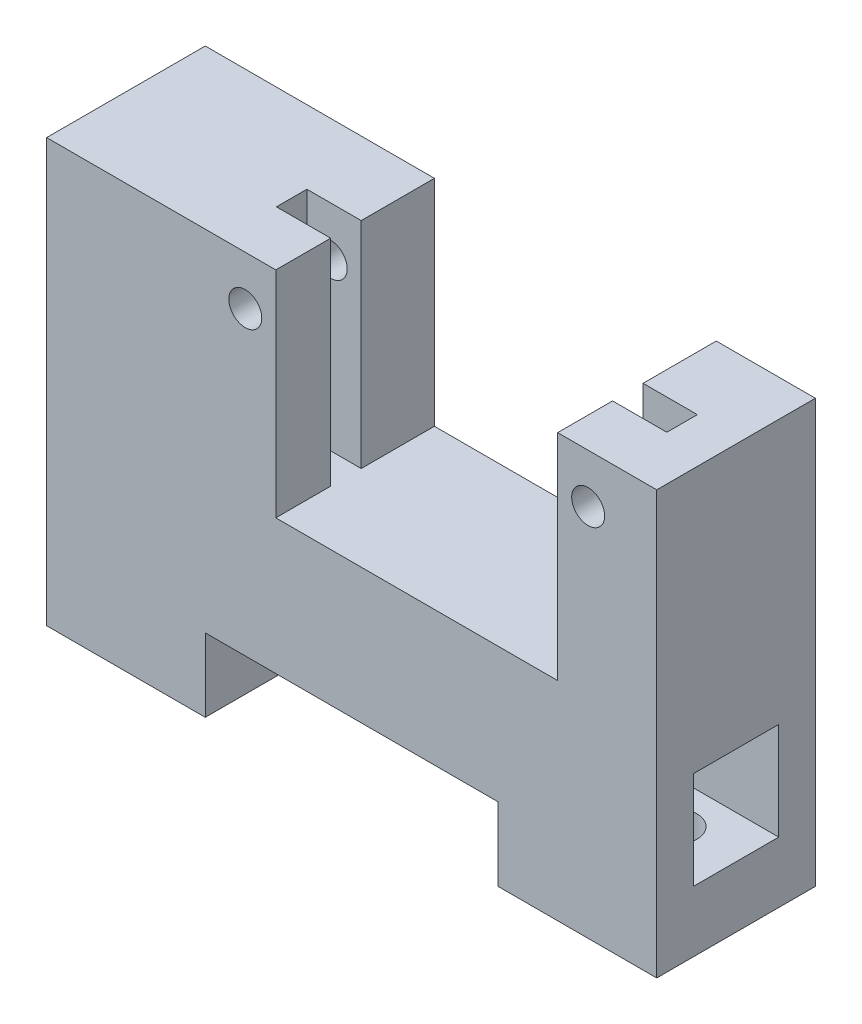
ISO-10303-21;
HEADER;
FILE_DESCRIPTION(('STEP AP214'),'2;1');
FILE_NAME('part.step','',(''),(''),'','','');
FILE_SCHEMA(('AUTOMOTIVE_DESIGN { 1 0 10303 214 1 1 1 1 }'));
ENDSEC;
DATA;
#1=APPLICATION_CONTEXT('core data for automotive mechanical design processes');
#2=APPLICATION_PROTOCOL_DEFINITION('international standard','automotive_design',2000,#1);
#3=PRODUCT_CONTEXT('',#1,'mechanical');
#4=PRODUCT('Part','Part','',(#3));
#5=PRODUCT_RELATED_PRODUCT_CATEGORY('part','',(#4));
#6=PRODUCT_DEFINITION_FORMATION('','',#4);
#7=PRODUCT_DEFINITION_CONTEXT('part definition',#1,'design');
#8=PRODUCT_DEFINITION('design','',#6,#7);
#9=PRODUCT_DEFINITION_SHAPE('','',#8);
#10=(LENGTH_UNIT() NAMED_UNIT(*) SI_UNIT(.MILLI.,.METRE.));
#11=(NAMED_UNIT(*) PLANE_ANGLE_UNIT() SI_UNIT($,.RADIAN.));
#12=(NAMED_UNIT(*) SI_UNIT($,.STERADIAN.) SOLID_ANGLE_UNIT());
#13=UNCERTAINTY_MEASURE_WITH_UNIT(LENGTH_MEASURE(1.E-05),#10,'distance_accuracy_value','');
#14=(GEOMETRIC_REPRESENTATION_CONTEXT(3) GLOBAL_UNCERTAINTY_ASSIGNED_CONTEXT((#13)) GLOBAL_UNIT_ASSIGNED_CONTEXT((#10,
#11,#12)) REPRESENTATION_CONTEXT('',''));
#15=CARTESIAN_POINT('',(0.,0.,0.));
#16=DIRECTION('',(0.,0.,1.));
#17=DIRECTION('',(1.,0.,0.));
#18=AXIS2_PLACEMENT_3D('',#15,#16,#17);
#19=CARTESIAN_POINT('',(0.,-2.65,0.));
#20=DIRECTION('',(0.,-1.,0.));
#21=DIRECTION('',(0.,0.,-1.));
#22=AXIS2_PLACEMENT_3D('',#19,#20,#21);
#23=PLANE('',#22);
#24=CARTESIAN_POINT('',(37.17,-2.65,0.499999999999999));
#25=DIRECTION('',(0.,-1.,0.));
#26=DIRECTION('',(0.,0.,-1.));
#27=AXIS2_PLACEMENT_3D('',#24,#25,#26);
#28=CIRCLE('',#27,1.8);
#29=CARTESIAN_POINT('',(37.17,-2.65,-1.3));
#30=VERTEX_POINT('',#29);
#31=EDGE_CURVE('E672',#30,#30,#28,.T.);
#32=ORIENTED_EDGE('',*,*,#31,.F.);
#33=EDGE_LOOP('',(#32));
#34=FACE_BOUND('',#33,.T.);
#35=DIRECTION('',(0.,0.,-1.));
#36=VECTOR('',#35,1.);
#37=CARTESIAN_POINT('',(29.17,-2.65,7.));
#38=LINE('',#37,#36);
#39=CARTESIAN_POINT('',(29.17,-2.65,7.));
#40=VERTEX_POINT('',#39);
#41=CARTESIAN_POINT('',(29.17,-2.65,-6.));
#42=VERTEX_POINT('',#41);
#43=EDGE_CURVE('E339',#40,#42,#38,.T.);
#44=ORIENTED_EDGE('',*,*,#43,.T.);
#45=DIRECTION('',(1.,0.,0.));
#46=VECTOR('',#45,1.);
#47=CARTESIAN_POINT('',(0.,-2.65,-6.));
#48=LINE('',#47,#46);
#49=CARTESIAN_POINT('',(42.17,-2.65,-6.));
#50=VERTEX_POINT('',#49);
#51=EDGE_CURVE('E389',#42,#50,#48,.T.);
#52=ORIENTED_EDGE('',*,*,#51,.T.);
#53=DIRECTION('',(0.,0.,-1.));
#54=VECTOR('',#53,1.);
#55=CARTESIAN_POINT('',(42.17,-2.65,7.));
#56=LINE('',#55,#54);
#57=CARTESIAN_POINT('',(42.17,-2.65,7.));
#58=VERTEX_POINT('',#57);
#59=EDGE_CURVE('E382',#58,#50,#56,.T.);
#60=ORIENTED_EDGE('',*,*,#59,.F.);
#61=DIRECTION('',(-1.,0.,0.));
#62=VECTOR('',#61,1.);
#63=CARTESIAN_POINT('',(45.,-2.65,7.));
#64=LINE('',#63,#62);
#65=EDGE_CURVE('E393',#58,#40,#64,.T.);
#66=ORIENTED_EDGE('',*,*,#65,.T.);
#67=EDGE_LOOP('',(#44,#52,#60,#66));
#68=FACE_BOUND('',#67,.T.);
#69=ADVANCED_FACE('F42',(#34,#68),#23,.T.);
#70=CARTESIAN_POINT('',(34.05,32.,-6.));
#71=DIRECTION('',(1.,0.,0.));
#72=DIRECTION('',(0.,0.,-1.));
#73=AXIS2_PLACEMENT_3D('',#70,#71,#72);
#74=PLANE('',#73);
#75=DIRECTION('',(0.,0.,1.));
#76=VECTOR('',#75,1.);
#77=CARTESIAN_POINT('',(34.05,32.,-6.));
#78=LINE('',#77,#76);
#79=CARTESIAN_POINT('',(34.05,32.,2.5));
#80=VERTEX_POINT('',#79);
#81=CARTESIAN_POINT('',(34.05,32.,7.));
#82=VERTEX_POINT('',#81);
#83=EDGE_CURVE('E519',#80,#82,#78,.T.);
#84=ORIENTED_EDGE('',*,*,#83,.F.);
#85=DIRECTION('',(0.,-1.,0.));
#86=VECTOR('',#85,1.);
#87=CARTESIAN_POINT('',(34.05,32.,2.5));
#88=LINE('',#87,#86);
#89=CARTESIAN_POINT('',(34.05,14.4,2.5));
#90=VERTEX_POINT('',#89);
#91=EDGE_CURVE('E479',#80,#90,#88,.T.);
#92=ORIENTED_EDGE('',*,*,#91,.T.);
#93=DIRECTION('',(0.,0.,1.));
#94=VECTOR('',#93,1.);
#95=CARTESIAN_POINT('',(34.05,14.4,-6.));
#96=LINE('',#95,#94);
#97=CARTESIAN_POINT('',(34.05,14.4,7.));
#98=VERTEX_POINT('',#97);
#99=EDGE_CURVE('E524',#90,#98,#96,.T.);
#100=ORIENTED_EDGE('',*,*,#99,.T.);
#101=DIRECTION('',(0.,-1.,0.));
#102=VECTOR('',#101,1.);
#103=CARTESIAN_POINT('',(34.05,0.,7.));
#104=LINE('',#103,#102);
#105=EDGE_CURVE('E486',#82,#98,#104,.T.);
#106=ORIENTED_EDGE('',*,*,#105,.F.);
#107=EDGE_LOOP('',(#84,#92,#100,#106));
#108=FACE_BOUND('',#107,.T.);
#109=ADVANCED_FACE('F610',(#108),#74,.F.);
#110=CARTESIAN_POINT('',(10.95,32.,-6.));
#111=DIRECTION('',(-1.,0.,0.));
#112=DIRECTION('',(0.,-1.,0.));
#113=AXIS2_PLACEMENT_3D('',#110,#111,#112);
#114=PLANE('',#113);
#115=DIRECTION('',(0.,0.,1.));
#116=VECTOR('',#115,1.);
#117=CARTESIAN_POINT('',(10.95,14.4,-6.));
#118=LINE('',#117,#116);
#119=CARTESIAN_POINT('',(10.95,14.4,2.5));
#120=VERTEX_POINT('',#119);
#121=CARTESIAN_POINT('',(10.95,14.4,7.));
#122=VERTEX_POINT('',#121);
#123=EDGE_CURVE('E529',#120,#122,#118,.T.);
#124=ORIENTED_EDGE('',*,*,#123,.F.);
#125=DIRECTION('',(0.,1.,0.));
#126=VECTOR('',#125,1.);
#127=CARTESIAN_POINT('',(10.95,32.,2.5));
#128=LINE('',#127,#126);
#129=CARTESIAN_POINT('',(10.95,32.,2.5));
#130=VERTEX_POINT('',#129);
#131=EDGE_CURVE('E12',#120,#130,#128,.T.);
#132=ORIENTED_EDGE('',*,*,#131,.T.);
#133=DIRECTION('',(0.,0.,1.));
#134=VECTOR('',#133,1.);
#135=CARTESIAN_POINT('',(10.95,32.,-6.));
#136=LINE('',#135,#134);
#137=CARTESIAN_POINT('',(10.95,32.,7.));
#138=VERTEX_POINT('',#137);
#139=EDGE_CURVE('E513',#130,#138,#136,.T.);
#140=ORIENTED_EDGE('',*,*,#139,.T.);
#141=DIRECTION('',(0.,1.,0.));
#142=VECTOR('',#141,1.);
#143=CARTESIAN_POINT('',(10.95,0.,7.));
#144=LINE('',#143,#142);
#145=EDGE_CURVE('E494',#122,#138,#144,.T.);
#146=ORIENTED_EDGE('',*,*,#145,.F.);
#147=EDGE_LOOP('',(#124,#132,#140,#146));
#148=FACE_BOUND('',#147,.T.);
#149=ADVANCED_FACE('F651',(#148),#114,.F.);
#150=CARTESIAN_POINT('',(0.,32.,0.));
#151=DIRECTION('',(0.,-1.,0.));
#152=DIRECTION('',(0.,0.,-1.));
#153=AXIS2_PLACEMENT_3D('',#150,#151,#152);
#154=PLANE('',#153);
#155=DIRECTION('',(-1.,0.,0.));
#156=VECTOR('',#155,1.);
#157=CARTESIAN_POINT('',(0.,32.,7.));
#158=LINE('',#157,#156);
#159=CARTESIAN_POINT('',(42.17,32.,7.));
#160=VERTEX_POINT('',#159);
#161=EDGE_CURVE('E483',#160,#82,#158,.T.);
#162=ORIENTED_EDGE('',*,*,#161,.F.);
#163=DIRECTION('',(0.,0.,-1.));
#164=VECTOR('',#163,1.);
#165=CARTESIAN_POINT('',(42.17,32.,7.));
#166=LINE('',#165,#164);
#167=CARTESIAN_POINT('',(42.17,32.,-6.));
#168=VERTEX_POINT('',#167);
#169=EDGE_CURVE('E385',#160,#168,#166,.T.);
#170=ORIENTED_EDGE('',*,*,#169,.T.);
#171=DIRECTION('',(-1.,0.,0.));
#172=VECTOR('',#171,1.);
#173=CARTESIAN_POINT('',(0.,32.,-6.));
#174=LINE('',#173,#172);
#175=CARTESIAN_POINT('',(34.05,32.,-6.));
#176=VERTEX_POINT('',#175);
#177=EDGE_CURVE('E534',#168,#176,#174,.T.);
#178=ORIENTED_EDGE('',*,*,#177,.T.);
#179=CARTESIAN_POINT('',(34.05,32.,0.));
#180=VERTEX_POINT('',#179);
#181=EDGE_CURVE('E514',#176,#180,#78,.T.);
#182=ORIENTED_EDGE('',*,*,#181,.T.);
#183=DIRECTION('',(-1.,0.,0.));
#184=VECTOR('',#183,1.);
#185=CARTESIAN_POINT('',(6.5,32.,0.));
#186=LINE('',#185,#184);
#187=CARTESIAN_POINT('',(38.5,32.,0.));
#188=VERTEX_POINT('',#187);
#189=EDGE_CURVE('E428',#188,#180,#186,.T.);
#190=ORIENTED_EDGE('',*,*,#189,.F.);
#191=DIRECTION('',(0.,0.,-1.));
#192=VECTOR('',#191,1.);
#193=CARTESIAN_POINT('',(38.5,32.,0.));
#194=LINE('',#193,#192);
#195=CARTESIAN_POINT('',(38.5,32.,2.5));
#196=VERTEX_POINT('',#195);
#197=EDGE_CURVE('E433',#196,#188,#194,.T.);
#198=ORIENTED_EDGE('',*,*,#197,.F.);
#199=DIRECTION('',(1.,0.,0.));
#200=VECTOR('',#199,1.);
#201=CARTESIAN_POINT('',(6.5,32.,2.5));
#202=LINE('',#201,#200);
#203=EDGE_CURVE('E440',#80,#196,#202,.T.);
#204=ORIENTED_EDGE('',*,*,#203,.F.);
#205=ORIENTED_EDGE('',*,*,#83,.T.);
#206=EDGE_LOOP('',(#162,#170,#178,#182,#190,#198,#204,#205));
#207=FACE_BOUND('',#206,.T.);
#208=ADVANCED_FACE('F557',(#207),#154,.F.);
#209=CARTESIAN_POINT('',(0.,32.,-6.));
#210=DIRECTION('',(0.,0.,1.));
#211=DIRECTION('',(1.,0.,0.));
#212=AXIS2_PLACEMENT_3D('',#209,#210,#211);
#213=PLANE('',#212);
#214=CARTESIAN_POINT('',(8.44999999999999,28.,-6.));
#215=DIRECTION('',(0.,0.,1.));
#216=DIRECTION('',(1.,0.,0.));
#217=AXIS2_PLACEMENT_3D('',#214,#215,#216);
#218=CIRCLE('',#217,1.35);
#219=CARTESIAN_POINT('',(9.79999999999999,28.,-6.));
#220=VERTEX_POINT('',#219);
#221=EDGE_CURVE('E423',#220,#220,#218,.T.);
#222=ORIENTED_EDGE('',*,*,#221,.T.);
#223=EDGE_LOOP('',(#222));
#224=FACE_BOUND('',#223,.T.);
#225=CARTESIAN_POINT('',(36.55,28.,-6.));
#226=DIRECTION('',(0.,0.,1.));
#227=DIRECTION('',(1.,0.,0.));
#228=AXIS2_PLACEMENT_3D('',#225,#226,#227);
#229=CIRCLE('',#228,1.35);
#230=CARTESIAN_POINT('',(37.9,28.,-6.));
#231=VERTEX_POINT('',#230);
#232=EDGE_CURVE('E415',#231,#231,#229,.T.);
#233=ORIENTED_EDGE('',*,*,#232,.T.);
#234=EDGE_LOOP('',(#233));
#235=FACE_BOUND('',#234,.T.);
#236=ORIENTED_EDGE('',*,*,#51,.F.);
#237=DIRECTION('',(0.,-1.,0.));
#238=VECTOR('',#237,1.);
#239=CARTESIAN_POINT('',(29.17,-2.65,-6.));
#240=LINE('',#239,#238);
#241=CARTESIAN_POINT('',(29.17,3.35,-6.));
#242=VERTEX_POINT('',#241);
#243=EDGE_CURVE('E317',#242,#42,#240,.T.);
#244=ORIENTED_EDGE('',*,*,#243,.F.);
#245=DIRECTION('',(1.,0.,0.));
#246=VECTOR('',#245,1.);
#247=CARTESIAN_POINT('',(29.17,3.35,-6.));
#248=LINE('',#247,#246);
#249=CARTESIAN_POINT('',(5.17,3.35,-6.));
#250=VERTEX_POINT('',#249);
#251=EDGE_CURVE('E331',#250,#242,#248,.T.);
#252=ORIENTED_EDGE('',*,*,#251,.F.);
#253=DIRECTION('',(0.,1.,0.));
#254=VECTOR('',#253,1.);
#255=CARTESIAN_POINT('',(5.17,-2.65,-6.));
#256=LINE('',#255,#254);
#257=CARTESIAN_POINT('',(5.17,-2.65,-6.));
#258=VERTEX_POINT('',#257);
#259=EDGE_CURVE('E342',#258,#250,#256,.T.);
#260=ORIENTED_EDGE('',*,*,#259,.F.);
#261=CARTESIAN_POINT('',(-7.83,-2.65,-6.));
#262=VERTEX_POINT('',#261);
#263=EDGE_CURVE('E399',#262,#258,#48,.T.);
#264=ORIENTED_EDGE('',*,*,#263,.F.);
#265=DIRECTION('',(0.,-1.,0.));
#266=VECTOR('',#265,1.);
#267=CARTESIAN_POINT('',(-7.83,32.,-6.));
#268=LINE('',#267,#266);
#269=CARTESIAN_POINT('',(-7.83,32.,-6.));
#270=VERTEX_POINT('',#269);
#271=EDGE_CURVE('E365',#270,#262,#268,.T.);
#272=ORIENTED_EDGE('',*,*,#271,.F.);
#273=CARTESIAN_POINT('',(10.95,32.,-6.));
#274=VERTEX_POINT('',#273);
#275=EDGE_CURVE('E518',#274,#270,#174,.T.);
#276=ORIENTED_EDGE('',*,*,#275,.F.);
#277=DIRECTION('',(0.,-1.,0.));
#278=VECTOR('',#277,1.);
#279=CARTESIAN_POINT('',(10.95,32.,-6.));
#280=LINE('',#279,#278);
#281=CARTESIAN_POINT('',(10.95,14.4,-6.));
#282=VERTEX_POINT('',#281);
#283=EDGE_CURVE('E501',#274,#282,#280,.T.);
#284=ORIENTED_EDGE('',*,*,#283,.T.);
#285=DIRECTION('',(1.,0.,0.));
#286=VECTOR('',#285,1.);
#287=CARTESIAN_POINT('',(10.95,14.4,-6.));
#288=LINE('',#287,#286);
#289=CARTESIAN_POINT('',(34.05,14.4,-6.));
#290=VERTEX_POINT('',#289);
#291=EDGE_CURVE('E505',#282,#290,#288,.T.);
#292=ORIENTED_EDGE('',*,*,#291,.T.);
#293=DIRECTION('',(0.,1.,0.));
#294=VECTOR('',#293,1.);
#295=CARTESIAN_POINT('',(34.05,32.,-6.));
#296=LINE('',#295,#294);
#297=EDGE_CURVE('E509',#290,#176,#296,.T.);
#298=ORIENTED_EDGE('',*,*,#297,.T.);
#299=ORIENTED_EDGE('',*,*,#177,.F.);
#300=DIRECTION('',(0.,1.,0.));
#301=VECTOR('',#300,1.);
#302=CARTESIAN_POINT('',(42.17,32.,-6.));
#303=LINE('',#302,#301);
#304=EDGE_CURVE('E377',#50,#168,#303,.T.);
#305=ORIENTED_EDGE('',*,*,#304,.F.);
#306=EDGE_LOOP('',(#236,#244,#252,#260,#264,#272,#276,#284,#292,#298,#299,#305));
#307=FACE_BOUND('',#306,.T.);
#308=ADVANCED_FACE('F44',(#224,#235,#307),#213,.F.);
#309=ORIENTED_EDGE('',*,*,#139,.F.);
#310=CARTESIAN_POINT('',(6.5,32.,2.5));
#311=VERTEX_POINT('',#310);
#312=EDGE_CURVE('E437',#311,#130,#202,.T.);
#313=ORIENTED_EDGE('',*,*,#312,.F.);
#314=DIRECTION('',(0.,0.,1.));
#315=VECTOR('',#314,1.);
#316=CARTESIAN_POINT('',(6.5,32.,0.));
#317=LINE('',#316,#315);
#318=CARTESIAN_POINT('',(6.5,32.,0.));
#319=VERTEX_POINT('',#318);
#320=EDGE_CURVE('E427',#319,#311,#317,.T.);
#321=ORIENTED_EDGE('',*,*,#320,.F.);
#322=CARTESIAN_POINT('',(10.95,32.,0.));
#323=VERTEX_POINT('',#322);
#324=EDGE_CURVE('E432',#323,#319,#186,.T.);
#325=ORIENTED_EDGE('',*,*,#324,.F.);
#326=EDGE_CURVE('E530',#274,#323,#136,.T.);
#327=ORIENTED_EDGE('',*,*,#326,.F.);
#328=ORIENTED_EDGE('',*,*,#275,.T.);
#329=DIRECTION('',(0.,0.,-1.));
#330=VECTOR('',#329,1.);
#331=CARTESIAN_POINT('',(-7.83,32.,7.));
#332=LINE('',#331,#330);
#333=CARTESIAN_POINT('',(-7.83,32.,7.));
#334=VERTEX_POINT('',#333);
#335=EDGE_CURVE('E352',#334,#270,#332,.T.);
#336=ORIENTED_EDGE('',*,*,#335,.F.);
#337=DIRECTION('',(-1.,0.,0.));
#338=VECTOR('',#337,1.);
#339=CARTESIAN_POINT('',(0.,32.,7.));
#340=LINE('',#339,#338);
#341=EDGE_CURVE('E498',#138,#334,#340,.T.);
#342=ORIENTED_EDGE('',*,*,#341,.F.);
#343=EDGE_LOOP('',(#309,#313,#321,#325,#327,#328,#336,#342));
#344=FACE_BOUND('',#343,.T.);
#345=ADVANCED_FACE('F556',(#344),#154,.F.);
#346=CARTESIAN_POINT('',(34.05,14.4,0.));
#347=VERTEX_POINT('',#346);
#348=EDGE_CURVE('E520',#290,#347,#96,.T.);
#349=ORIENTED_EDGE('',*,*,#348,.T.);
#350=DIRECTION('',(0.,1.,0.));
#351=VECTOR('',#350,1.);
#352=CARTESIAN_POINT('',(34.05,32.,0.));
#353=LINE('',#352,#351);
#354=EDGE_CURVE('E475',#347,#180,#353,.T.);
#355=ORIENTED_EDGE('',*,*,#354,.T.);
#356=ORIENTED_EDGE('',*,*,#181,.F.);
#357=ORIENTED_EDGE('',*,*,#297,.F.);
#358=EDGE_LOOP('',(#349,#355,#356,#357));
#359=FACE_BOUND('',#358,.T.);
#360=ADVANCED_FACE('F653',(#359),#74,.F.);
#361=CARTESIAN_POINT('',(10.95,14.4,-6.));
#362=DIRECTION('',(0.,-1.,0.));
#363=DIRECTION('',(1.,0.,0.));
#364=AXIS2_PLACEMENT_3D('',#361,#362,#363);
#365=PLANE('',#364);
#366=CARTESIAN_POINT('',(10.95,14.4,0.));
#367=VERTEX_POINT('',#366);
#368=EDGE_CURVE('E525',#282,#367,#118,.T.);
#369=ORIENTED_EDGE('',*,*,#368,.T.);
#370=DIRECTION('',(-1.,0.,0.));
#371=VECTOR('',#370,1.);
#372=CARTESIAN_POINT('',(6.49999999999999,14.4,0.));
#373=LINE('',#372,#371);
#374=CARTESIAN_POINT('',(6.5,14.4,0.));
#375=VERTEX_POINT('',#374);
#376=EDGE_CURVE('E459',#367,#375,#373,.T.);
#377=ORIENTED_EDGE('',*,*,#376,.T.);
#378=DIRECTION('',(0.,0.,1.));
#379=VECTOR('',#378,1.);
#380=CARTESIAN_POINT('',(6.5,14.4,0.));
#381=LINE('',#380,#379);
#382=CARTESIAN_POINT('',(6.5,14.4,2.5));
#383=VERTEX_POINT('',#382);
#384=EDGE_CURVE('E449',#375,#383,#381,.T.);
#385=ORIENTED_EDGE('',*,*,#384,.T.);
#386=DIRECTION('',(1.,0.,0.));
#387=VECTOR('',#386,1.);
#388=CARTESIAN_POINT('',(6.49999999999999,14.4,2.5));
#389=LINE('',#388,#387);
#390=EDGE_CURVE('E444',#383,#120,#389,.T.);
#391=ORIENTED_EDGE('',*,*,#390,.T.);
#392=ORIENTED_EDGE('',*,*,#123,.T.);
#393=DIRECTION('',(-1.,0.,0.));
#394=VECTOR('',#393,1.);
#395=CARTESIAN_POINT('',(0.,14.4,7.));
#396=LINE('',#395,#394);
#397=EDGE_CURVE('E490',#98,#122,#396,.T.);
#398=ORIENTED_EDGE('',*,*,#397,.F.);
#399=ORIENTED_EDGE('',*,*,#99,.F.);
#400=CARTESIAN_POINT('',(38.5,14.4,2.5));
#401=VERTEX_POINT('',#400);
#402=EDGE_CURVE('E431',#90,#401,#389,.T.);
#403=ORIENTED_EDGE('',*,*,#402,.T.);
#404=DIRECTION('',(0.,0.,-1.));
#405=VECTOR('',#404,1.);
#406=CARTESIAN_POINT('',(38.5,14.4,0.));
#407=LINE('',#406,#405);
#408=CARTESIAN_POINT('',(38.5,14.4,0.));
#409=VERTEX_POINT('',#408);
#410=EDGE_CURVE('E460',#401,#409,#407,.T.);
#411=ORIENTED_EDGE('',*,*,#410,.T.);
#412=EDGE_CURVE('E455',#409,#347,#373,.T.);
#413=ORIENTED_EDGE('',*,*,#412,.T.);
#414=ORIENTED_EDGE('',*,*,#348,.F.);
#415=ORIENTED_EDGE('',*,*,#291,.F.);
#416=EDGE_LOOP('',(#369,#377,#385,#391,#392,#398,#399,#403,#411,#413,#414,#415));
#417=FACE_BOUND('',#416,.T.);
#418=ADVANCED_FACE('F614',(#417),#365,.F.);
#419=ORIENTED_EDGE('',*,*,#326,.T.);
#420=DIRECTION('',(0.,-1.,0.));
#421=VECTOR('',#420,1.);
#422=CARTESIAN_POINT('',(10.95,32.,0.));
#423=LINE('',#422,#421);
#424=EDGE_CURVE('E52',#323,#367,#423,.T.);
#425=ORIENTED_EDGE('',*,*,#424,.T.);
#426=ORIENTED_EDGE('',*,*,#368,.F.);
#427=ORIENTED_EDGE('',*,*,#283,.F.);
#428=EDGE_LOOP('',(#419,#425,#426,#427));
#429=FACE_BOUND('',#428,.T.);
#430=ADVANCED_FACE('F822',(#429),#114,.F.);
#431=CARTESIAN_POINT('',(0.,0.,7.));
#432=DIRECTION('',(0.,0.,1.));
#433=DIRECTION('',(1.,0.,0.));
#434=AXIS2_PLACEMENT_3D('',#431,#432,#433);
#435=PLANE('',#434);
#436=DIRECTION('',(0.,-1.,0.));
#437=VECTOR('',#436,1.);
#438=CARTESIAN_POINT('',(29.17,-2.65,7.));
#439=LINE('',#438,#437);
#440=CARTESIAN_POINT('',(29.17,3.35,7.));
#441=VERTEX_POINT('',#440);
#442=EDGE_CURVE('E326',#441,#40,#439,.T.);
#443=ORIENTED_EDGE('',*,*,#442,.T.);
#444=ORIENTED_EDGE('',*,*,#65,.F.);
#445=DIRECTION('',(0.,1.,0.));
#446=VECTOR('',#445,1.);
#447=CARTESIAN_POINT('',(42.17,32.,7.));
#448=LINE('',#447,#446);
#449=EDGE_CURVE('E378',#58,#160,#448,.T.);
#450=ORIENTED_EDGE('',*,*,#449,.T.);
#451=ORIENTED_EDGE('',*,*,#161,.T.);
#452=ORIENTED_EDGE('',*,*,#105,.T.);
#453=ORIENTED_EDGE('',*,*,#397,.T.);
#454=ORIENTED_EDGE('',*,*,#145,.T.);
#455=ORIENTED_EDGE('',*,*,#341,.T.);
#456=DIRECTION('',(0.,1.,0.));
#457=VECTOR('',#456,1.);
#458=CARTESIAN_POINT('',(-7.83,-2.65,7.));
#459=LINE('',#458,#457);
#460=CARTESIAN_POINT('',(-7.83,-2.65,7.));
#461=VERTEX_POINT('',#460);
#462=EDGE_CURVE('E373',#461,#334,#459,.T.);
#463=ORIENTED_EDGE('',*,*,#462,.F.);
#464=CARTESIAN_POINT('',(5.16999999999999,-2.65,7.));
#465=VERTEX_POINT('',#464);
#466=EDGE_CURVE('E398',#465,#461,#64,.T.);
#467=ORIENTED_EDGE('',*,*,#466,.F.);
#468=DIRECTION('',(0.,1.,0.));
#469=VECTOR('',#468,1.);
#470=CARTESIAN_POINT('',(5.17,-2.65,7.));
#471=LINE('',#470,#469);
#472=CARTESIAN_POINT('',(5.17,3.35,7.));
#473=VERTEX_POINT('',#472);
#474=EDGE_CURVE('E330',#465,#473,#471,.T.);
#475=ORIENTED_EDGE('',*,*,#474,.T.);
#476=DIRECTION('',(1.,0.,0.));
#477=VECTOR('',#476,1.);
#478=CARTESIAN_POINT('',(29.17,3.35,7.));
#479=LINE('',#478,#477);
#480=EDGE_CURVE('E335',#473,#441,#479,.T.);
#481=ORIENTED_EDGE('',*,*,#480,.T.);
#482=EDGE_LOOP('',(#443,#444,#450,#451,#452,#453,#454,#455,#463,#467,#475,#481));
#483=FACE_BOUND('',#482,.T.);
#484=CARTESIAN_POINT('',(8.44999999999999,28.,7.));
#485=DIRECTION('',(0.,0.,1.));
#486=DIRECTION('',(1.,0.,0.));
#487=AXIS2_PLACEMENT_3D('',#484,#485,#486);
#488=CIRCLE('',#487,1.35);
#489=CARTESIAN_POINT('',(9.79999999999999,28.,7.));
#490=VERTEX_POINT('',#489);
#491=EDGE_CURVE('E403',#490,#490,#488,.T.);
#492=ORIENTED_EDGE('',*,*,#491,.F.);
#493=EDGE_LOOP('',(#492));
#494=FACE_BOUND('',#493,.T.);
#495=CARTESIAN_POINT('',(36.55,28.,7.));
#496=DIRECTION('',(0.,0.,1.));
#497=DIRECTION('',(1.,0.,0.));
#498=AXIS2_PLACEMENT_3D('',#495,#496,#497);
#499=CIRCLE('',#498,1.35);
#500=CARTESIAN_POINT('',(37.9,28.,7.));
#501=VERTEX_POINT('',#500);
#502=EDGE_CURVE('E397',#501,#501,#499,.T.);
#503=ORIENTED_EDGE('',*,*,#502,.F.);
#504=EDGE_LOOP('',(#503));
#505=FACE_BOUND('',#504,.T.);
#506=ADVANCED_FACE('F579',(#483,#494,#505),#435,.T.);
#507=CARTESIAN_POINT('',(6.5,-17.6975076914081,2.5));
#508=DIRECTION('',(0.,0.,1.));
#509=DIRECTION('',(1.,0.,0.));
#510=AXIS2_PLACEMENT_3D('',#507,#508,#509);
#511=PLANE('',#510);
#512=CARTESIAN_POINT('',(8.44999999999999,28.,2.50000000000001));
#513=DIRECTION('',(0.,0.,1.));
#514=DIRECTION('',(1.,0.,0.));
#515=AXIS2_PLACEMENT_3D('',#512,#513,#514);
#516=CIRCLE('',#515,1.35);
#517=CARTESIAN_POINT('',(9.79999999999999,28.,2.50000000000001));
#518=VERTEX_POINT('',#517);
#519=EDGE_CURVE('E419',#518,#518,#516,.T.);
#520=ORIENTED_EDGE('',*,*,#519,.T.);
#521=EDGE_LOOP('',(#520));
#522=FACE_BOUND('',#521,.T.);
#523=ORIENTED_EDGE('',*,*,#390,.F.);
#524=DIRECTION('',(0.,1.,0.));
#525=VECTOR('',#524,1.);
#526=CARTESIAN_POINT('',(6.5,-17.6975076914081,2.5));
#527=LINE('',#526,#525);
#528=EDGE_CURVE('E453',#383,#311,#527,.T.);
#529=ORIENTED_EDGE('',*,*,#528,.T.);
#530=ORIENTED_EDGE('',*,*,#312,.T.);
#531=ORIENTED_EDGE('',*,*,#131,.F.);
#532=EDGE_LOOP('',(#523,#529,#530,#531));
#533=FACE_BOUND('',#532,.T.);
#534=ADVANCED_FACE('F821',(#522,#533),#511,.F.);
#535=CARTESIAN_POINT('',(6.5,-17.6975076914081,0.));
#536=DIRECTION('',(0.,0.,-1.));
#537=DIRECTION('',(-1.,0.,0.));
#538=AXIS2_PLACEMENT_3D('',#535,#536,#537);
#539=PLANE('',#538);
#540=CARTESIAN_POINT('',(8.44999999999999,28.,0.));
#541=DIRECTION('',(0.,0.,-1.));
#542=DIRECTION('',(-1.,0.,0.));
#543=AXIS2_PLACEMENT_3D('',#540,#541,#542);
#544=CIRCLE('',#543,1.35);
#545=CARTESIAN_POINT('',(7.09999999999999,28.,0.));
#546=VERTEX_POINT('',#545);
#547=EDGE_CURVE('E46',#546,#546,#544,.T.);
#548=ORIENTED_EDGE('',*,*,#547,.T.);
#549=EDGE_LOOP('',(#548));
#550=FACE_BOUND('',#549,.T.);
#551=ORIENTED_EDGE('',*,*,#324,.T.);
#552=DIRECTION('',(0.,1.,0.));
#553=VECTOR('',#552,1.);
#554=CARTESIAN_POINT('',(6.5,-17.6975076914081,0.));
#555=LINE('',#554,#553);
#556=EDGE_CURVE('E454',#375,#319,#555,.T.);
#557=ORIENTED_EDGE('',*,*,#556,.F.);
#558=ORIENTED_EDGE('',*,*,#376,.F.);
#559=ORIENTED_EDGE('',*,*,#424,.F.);
#560=EDGE_LOOP('',(#551,#557,#558,#559));
#561=FACE_BOUND('',#560,.T.);
#562=ADVANCED_FACE('F628',(#550,#561),#539,.F.);
#563=CARTESIAN_POINT('',(6.5,-17.6975076914081,0.));
#564=DIRECTION('',(-1.,0.,0.));
#565=DIRECTION('',(0.,0.,1.));
#566=AXIS2_PLACEMENT_3D('',#563,#564,#565);
#567=PLANE('',#566);
#568=ORIENTED_EDGE('',*,*,#556,.T.);
#569=ORIENTED_EDGE('',*,*,#320,.T.);
#570=ORIENTED_EDGE('',*,*,#528,.F.);
#571=ORIENTED_EDGE('',*,*,#384,.F.);
#572=EDGE_LOOP('',(#568,#569,#570,#571));
#573=FACE_BOUND('',#572,.T.);
#574=ADVANCED_FACE('F895',(#573),#567,.F.);
#575=CARTESIAN_POINT('',(36.55,28.,2.5));
#576=DIRECTION('',(0.,0.,1.));
#577=DIRECTION('',(1.,0.,0.));
#578=AXIS2_PLACEMENT_3D('',#575,#576,#577);
#579=CIRCLE('',#578,1.35);
#580=CARTESIAN_POINT('',(37.9,28.,2.5));
#581=VERTEX_POINT('',#580);
#582=EDGE_CURVE('E411',#581,#581,#579,.T.);
#583=ORIENTED_EDGE('',*,*,#582,.T.);
#584=EDGE_LOOP('',(#583));
#585=FACE_BOUND('',#584,.T.);
#586=ORIENTED_EDGE('',*,*,#203,.T.);
#587=DIRECTION('',(0.,1.,0.));
#588=VECTOR('',#587,1.);
#589=CARTESIAN_POINT('',(38.5,-17.6975076914081,2.5));
#590=LINE('',#589,#588);
#591=EDGE_CURVE('E448',#401,#196,#590,.T.);
#592=ORIENTED_EDGE('',*,*,#591,.F.);
#593=ORIENTED_EDGE('',*,*,#402,.F.);
#594=ORIENTED_EDGE('',*,*,#91,.F.);
#595=EDGE_LOOP('',(#586,#592,#593,#594));
#596=FACE_BOUND('',#595,.T.);
#597=ADVANCED_FACE('F886',(#585,#596),#511,.F.);
#598=CARTESIAN_POINT('',(36.55,28.,0.));
#599=DIRECTION('',(0.,0.,-1.));
#600=DIRECTION('',(-1.,0.,0.));
#601=AXIS2_PLACEMENT_3D('',#598,#599,#600);
#602=CIRCLE('',#601,1.35);
#603=CARTESIAN_POINT('',(35.2,28.,0.));
#604=VERTEX_POINT('',#603);
#605=EDGE_CURVE('E407',#604,#604,#602,.T.);
#606=ORIENTED_EDGE('',*,*,#605,.T.);
#607=EDGE_LOOP('',(#606));
#608=FACE_BOUND('',#607,.T.);
#609=ORIENTED_EDGE('',*,*,#412,.F.);
#610=DIRECTION('',(0.,1.,0.));
#611=VECTOR('',#610,1.);
#612=CARTESIAN_POINT('',(38.5,-17.6975076914081,0.));
#613=LINE('',#612,#611);
#614=EDGE_CURVE('E464',#409,#188,#613,.T.);
#615=ORIENTED_EDGE('',*,*,#614,.T.);
#616=ORIENTED_EDGE('',*,*,#189,.T.);
#617=ORIENTED_EDGE('',*,*,#354,.F.);
#618=EDGE_LOOP('',(#609,#615,#616,#617));
#619=FACE_BOUND('',#618,.T.);
#620=ADVANCED_FACE('F543',(#608,#619),#539,.F.);
#621=CARTESIAN_POINT('',(38.5,-17.6975076914081,0.));
#622=DIRECTION('',(1.,0.,0.));
#623=DIRECTION('',(0.,0.,-1.));
#624=AXIS2_PLACEMENT_3D('',#621,#622,#623);
#625=PLANE('',#624);
#626=ORIENTED_EDGE('',*,*,#591,.T.);
#627=ORIENTED_EDGE('',*,*,#197,.T.);
#628=ORIENTED_EDGE('',*,*,#614,.F.);
#629=ORIENTED_EDGE('',*,*,#410,.F.);
#630=EDGE_LOOP('',(#626,#627,#628,#629));
#631=FACE_BOUND('',#630,.T.);
#632=ADVANCED_FACE('F550',(#631),#625,.F.);
#633=CARTESIAN_POINT('',(36.55,28.,-20.));
#634=DIRECTION('',(0.,0.,1.));
#635=DIRECTION('',(1.,0.,0.));
#636=AXIS2_PLACEMENT_3D('',#633,#634,#635);
#637=CYLINDRICAL_SURFACE('',#636,1.35);
#638=ORIENTED_EDGE('',*,*,#605,.F.);
#639=EDGE_LOOP('',(#638));
#640=FACE_BOUND('',#639,.T.);
#641=ORIENTED_EDGE('',*,*,#232,.F.);
#642=EDGE_LOOP('',(#641));
#643=FACE_BOUND('',#642,.T.);
#644=ADVANCED_FACE('F546',(#640,#643),#637,.F.);
#645=ORIENTED_EDGE('',*,*,#502,.T.);
#646=EDGE_LOOP('',(#645));
#647=FACE_BOUND('',#646,.T.);
#648=ORIENTED_EDGE('',*,*,#582,.F.);
#649=EDGE_LOOP('',(#648));
#650=FACE_BOUND('',#649,.T.);
#651=ADVANCED_FACE('F549',(#647,#650),#637,.F.);
#652=CARTESIAN_POINT('',(8.44999999999999,28.,-20.));
#653=DIRECTION('',(0.,0.,1.));
#654=DIRECTION('',(1.,0.,0.));
#655=AXIS2_PLACEMENT_3D('',#652,#653,#654);
#656=CYLINDRICAL_SURFACE('',#655,1.35);
#657=ORIENTED_EDGE('',*,*,#547,.F.);
#658=EDGE_LOOP('',(#657));
#659=FACE_BOUND('',#658,.T.);
#660=ORIENTED_EDGE('',*,*,#221,.F.);
#661=EDGE_LOOP('',(#660));
#662=FACE_BOUND('',#661,.T.);
#663=ADVANCED_FACE('F631',(#659,#662),#656,.F.);
#664=ORIENTED_EDGE('',*,*,#491,.T.);
#665=EDGE_LOOP('',(#664));
#666=FACE_BOUND('',#665,.T.);
#667=ORIENTED_EDGE('',*,*,#519,.F.);
#668=EDGE_LOOP('',(#667));
#669=FACE_BOUND('',#668,.T.);
#670=ADVANCED_FACE('F634',(#666,#669),#656,.F.);
#671=CARTESIAN_POINT('',(-2.83,-2.65,0.5));
#672=DIRECTION('',(0.,-1.,0.));
#673=DIRECTION('',(0.,0.,-1.));
#674=AXIS2_PLACEMENT_3D('',#671,#672,#673);
#675=CIRCLE('',#674,1.8);
#676=CARTESIAN_POINT('',(-2.83,-2.65,-1.3));
#677=VERTEX_POINT('',#676);
#678=EDGE_CURVE('E665',#677,#677,#675,.T.);
#679=ORIENTED_EDGE('',*,*,#678,.F.);
#680=EDGE_LOOP('',(#679));
#681=FACE_BOUND('',#680,.T.);
#682=DIRECTION('',(0.,0.,-1.));
#683=VECTOR('',#682,1.);
#684=CARTESIAN_POINT('',(5.17,-2.65,7.));
#685=LINE('',#684,#683);
#686=EDGE_CURVE('E356',#465,#258,#685,.T.);
#687=ORIENTED_EDGE('',*,*,#686,.F.);
#688=ORIENTED_EDGE('',*,*,#466,.T.);
#689=DIRECTION('',(0.,0.,1.));
#690=VECTOR('',#689,1.);
#691=CARTESIAN_POINT('',(-7.83,-2.65,-6.));
#692=LINE('',#691,#690);
#693=EDGE_CURVE('E369',#262,#461,#692,.T.);
#694=ORIENTED_EDGE('',*,*,#693,.F.);
#695=ORIENTED_EDGE('',*,*,#263,.T.);
#696=EDGE_LOOP('',(#687,#688,#694,#695));
#697=FACE_BOUND('',#696,.T.);
#698=ADVANCED_FACE('F572',(#681,#697),#23,.T.);
#699=CARTESIAN_POINT('',(42.17,32.,7.));
#700=DIRECTION('',(-1.,0.,0.));
#701=DIRECTION('',(0.,-1.,0.));
#702=AXIS2_PLACEMENT_3D('',#699,#700,#701);
#703=PLANE('',#702);
#704=DIRECTION('',(0.,0.,-1.));
#705=VECTOR('',#704,1.);
#706=CARTESIAN_POINT('',(42.17,2.35,4.));
#707=LINE('',#706,#705);
#708=CARTESIAN_POINT('',(42.17,2.35,4.));
#709=VERTEX_POINT('',#708);
#710=CARTESIAN_POINT('',(42.17,2.35,-3.));
#711=VERTEX_POINT('',#710);
#712=EDGE_CURVE('E303',#709,#711,#707,.T.);
#713=ORIENTED_EDGE('',*,*,#712,.F.);
#714=DIRECTION('',(0.,-1.,0.));
#715=VECTOR('',#714,1.);
#716=CARTESIAN_POINT('',(42.17,10.35,4.));
#717=LINE('',#716,#715);
#718=CARTESIAN_POINT('',(42.17,10.35,4.));
#719=VERTEX_POINT('',#718);
#720=EDGE_CURVE('E68',#719,#709,#717,.T.);
#721=ORIENTED_EDGE('',*,*,#720,.F.);
#722=DIRECTION('',(0.,0.,1.));
#723=VECTOR('',#722,1.);
#724=CARTESIAN_POINT('',(42.17,10.35,4.));
#725=LINE('',#724,#723);
#726=CARTESIAN_POINT('',(42.17,10.35,-3.));
#727=VERTEX_POINT('',#726);
#728=EDGE_CURVE('E288',#727,#719,#725,.T.);
#729=ORIENTED_EDGE('',*,*,#728,.F.);
#730=DIRECTION('',(0.,1.,0.));
#731=VECTOR('',#730,1.);
#732=CARTESIAN_POINT('',(42.17,10.35,-3.));
#733=LINE('',#732,#731);
#734=EDGE_CURVE('E307',#711,#727,#733,.T.);
#735=ORIENTED_EDGE('',*,*,#734,.F.);
#736=EDGE_LOOP('',(#713,#721,#729,#735));
#737=FACE_BOUND('',#736,.T.);
#738=ORIENTED_EDGE('',*,*,#304,.T.);
#739=ORIENTED_EDGE('',*,*,#169,.F.);
#740=ORIENTED_EDGE('',*,*,#449,.F.);
#741=ORIENTED_EDGE('',*,*,#59,.T.);
#742=EDGE_LOOP('',(#738,#739,#740,#741));
#743=FACE_BOUND('',#742,.T.);
#744=ADVANCED_FACE('F656',(#737,#743),#703,.F.);
#745=CARTESIAN_POINT('',(-7.83,0.,0.));
#746=DIRECTION('',(-1.,0.,0.));
#747=DIRECTION('',(0.,0.,1.));
#748=AXIS2_PLACEMENT_3D('',#745,#746,#747);
#749=PLANE('',#748);
#750=DIRECTION('',(0.,0.,-1.));
#751=VECTOR('',#750,1.);
#752=CARTESIAN_POINT('',(-7.83,10.35,4.));
#753=LINE('',#752,#751);
#754=CARTESIAN_POINT('',(-7.83,10.35,4.));
#755=VERTEX_POINT('',#754);
#756=CARTESIAN_POINT('',(-7.83,10.35,-3.));
#757=VERTEX_POINT('',#756);
#758=EDGE_CURVE('E60',#755,#757,#753,.T.);
#759=ORIENTED_EDGE('',*,*,#758,.F.);
#760=DIRECTION('',(0.,1.,0.));
#761=VECTOR('',#760,1.);
#762=CARTESIAN_POINT('',(-7.83,2.35,4.));
#763=LINE('',#762,#761);
#764=CARTESIAN_POINT('',(-7.83,2.35,4.));
#765=VERTEX_POINT('',#764);
#766=EDGE_CURVE('E253',#765,#755,#763,.T.);
#767=ORIENTED_EDGE('',*,*,#766,.F.);
#768=DIRECTION('',(0.,0.,1.));
#769=VECTOR('',#768,1.);
#770=CARTESIAN_POINT('',(-7.83,2.35,-3.));
#771=LINE('',#770,#769);
#772=CARTESIAN_POINT('',(-7.83,2.35,-3.));
#773=VERTEX_POINT('',#772);
#774=EDGE_CURVE('E257',#773,#765,#771,.T.);
#775=ORIENTED_EDGE('',*,*,#774,.F.);
#776=DIRECTION('',(0.,-1.,0.));
#777=VECTOR('',#776,1.);
#778=CARTESIAN_POINT('',(-7.83,10.35,-3.));
#779=LINE('',#778,#777);
#780=EDGE_CURVE('E269',#757,#773,#779,.T.);
#781=ORIENTED_EDGE('',*,*,#780,.F.);
#782=EDGE_LOOP('',(#759,#767,#775,#781));
#783=FACE_BOUND('',#782,.T.);
#784=ORIENTED_EDGE('',*,*,#335,.T.);
#785=ORIENTED_EDGE('',*,*,#271,.T.);
#786=ORIENTED_EDGE('',*,*,#693,.T.);
#787=ORIENTED_EDGE('',*,*,#462,.T.);
#788=EDGE_LOOP('',(#784,#785,#786,#787));
#789=FACE_BOUND('',#788,.T.);
#790=ADVANCED_FACE('F576',(#783,#789),#749,.T.);
#791=CARTESIAN_POINT('',(29.17,-2.65,7.));
#792=DIRECTION('',(1.,0.,0.));
#793=DIRECTION('',(0.,1.,0.));
#794=AXIS2_PLACEMENT_3D('',#791,#792,#793);
#795=PLANE('',#794);
#796=ORIENTED_EDGE('',*,*,#243,.T.);
#797=ORIENTED_EDGE('',*,*,#43,.F.);
#798=ORIENTED_EDGE('',*,*,#442,.F.);
#799=DIRECTION('',(0.,0.,-1.));
#800=VECTOR('',#799,1.);
#801=CARTESIAN_POINT('',(29.17,3.35,7.));
#802=LINE('',#801,#800);
#803=EDGE_CURVE('E349',#441,#242,#802,.T.);
#804=ORIENTED_EDGE('',*,*,#803,.T.);
#805=EDGE_LOOP('',(#796,#797,#798,#804));
#806=FACE_BOUND('',#805,.T.);
#807=ADVANCED_FACE('F599',(#806),#795,.F.);
#808=CARTESIAN_POINT('',(29.17,3.35,7.));
#809=DIRECTION('',(0.,1.,0.));
#810=DIRECTION('',(0.,0.,1.));
#811=AXIS2_PLACEMENT_3D('',#808,#809,#810);
#812=PLANE('',#811);
#813=ORIENTED_EDGE('',*,*,#251,.T.);
#814=ORIENTED_EDGE('',*,*,#803,.F.);
#815=ORIENTED_EDGE('',*,*,#480,.F.);
#816=DIRECTION('',(0.,0.,-1.));
#817=VECTOR('',#816,1.);
#818=CARTESIAN_POINT('',(5.17,3.35,7.));
#819=LINE('',#818,#817);
#820=EDGE_CURVE('E353',#473,#250,#819,.T.);
#821=ORIENTED_EDGE('',*,*,#820,.T.);
#822=EDGE_LOOP('',(#813,#814,#815,#821));
#823=FACE_BOUND('',#822,.T.);
#824=ADVANCED_FACE('F597',(#823),#812,.F.);
#825=CARTESIAN_POINT('',(5.17,-2.65,7.));
#826=DIRECTION('',(-1.,0.,0.));
#827=DIRECTION('',(0.,-1.,0.));
#828=AXIS2_PLACEMENT_3D('',#825,#826,#827);
#829=PLANE('',#828);
#830=ORIENTED_EDGE('',*,*,#259,.T.);
#831=ORIENTED_EDGE('',*,*,#820,.F.);
#832=ORIENTED_EDGE('',*,*,#474,.F.);
#833=ORIENTED_EDGE('',*,*,#686,.T.);
#834=EDGE_LOOP('',(#830,#831,#832,#833));
#835=FACE_BOUND('',#834,.T.);
#836=ADVANCED_FACE('F592',(#835),#829,.F.);
#837=CARTESIAN_POINT('',(32.17,10.35,4.));
#838=DIRECTION('',(0.,0.,1.));
#839=DIRECTION('',(0.,-1.,0.));
#840=AXIS2_PLACEMENT_3D('',#837,#838,#839);
#841=PLANE('',#840);
#842=ORIENTED_EDGE('',*,*,#720,.T.);
#843=DIRECTION('',(1.,0.,0.));
#844=VECTOR('',#843,1.);
#845=CARTESIAN_POINT('',(32.17,2.35,4.));
#846=LINE('',#845,#844);
#847=CARTESIAN_POINT('',(32.17,2.35,4.));
#848=VERTEX_POINT('',#847);
#849=EDGE_CURVE('E300',#848,#709,#846,.T.);
#850=ORIENTED_EDGE('',*,*,#849,.F.);
#851=DIRECTION('',(0.,-1.,0.));
#852=VECTOR('',#851,1.);
#853=CARTESIAN_POINT('',(32.17,10.35,4.));
#854=LINE('',#853,#852);
#855=CARTESIAN_POINT('',(32.17,10.35,4.));
#856=VERTEX_POINT('',#855);
#857=EDGE_CURVE('E283',#856,#848,#854,.T.);
#858=ORIENTED_EDGE('',*,*,#857,.F.);
#859=DIRECTION('',(1.,0.,0.));
#860=VECTOR('',#859,1.);
#861=CARTESIAN_POINT('',(32.17,10.35,4.));
#862=LINE('',#861,#860);
#863=EDGE_CURVE('E314',#856,#719,#862,.T.);
#864=ORIENTED_EDGE('',*,*,#863,.T.);
#865=EDGE_LOOP('',(#842,#850,#858,#864));
#866=FACE_BOUND('',#865,.T.);
#867=ADVANCED_FACE('F716',(#866),#841,.F.);
#868=CARTESIAN_POINT('',(32.17,10.35,4.));
#869=DIRECTION('',(0.,1.,0.));
#870=DIRECTION('',(-1.,0.,0.));
#871=AXIS2_PLACEMENT_3D('',#868,#869,#870);
#872=PLANE('',#871);
#873=ORIENTED_EDGE('',*,*,#728,.T.);
#874=ORIENTED_EDGE('',*,*,#863,.F.);
#875=DIRECTION('',(0.,0.,1.));
#876=VECTOR('',#875,1.);
#877=CARTESIAN_POINT('',(32.17,10.35,4.));
#878=LINE('',#877,#876);
#879=CARTESIAN_POINT('',(32.17,10.35,-3.));
#880=VERTEX_POINT('',#879);
#881=EDGE_CURVE('E296',#880,#856,#878,.T.);
#882=ORIENTED_EDGE('',*,*,#881,.F.);
#883=DIRECTION('',(1.,0.,0.));
#884=VECTOR('',#883,1.);
#885=CARTESIAN_POINT('',(32.17,10.35,-3.));
#886=LINE('',#885,#884);
#887=EDGE_CURVE('E318',#880,#727,#886,.T.);
#888=ORIENTED_EDGE('',*,*,#887,.T.);
#889=EDGE_LOOP('',(#873,#874,#882,#888));
#890=FACE_BOUND('',#889,.T.);
#891=ADVANCED_FACE('F712',(#890),#872,.F.);
#892=CARTESIAN_POINT('',(32.17,10.35,-3.));
#893=DIRECTION('',(0.,0.,-1.));
#894=DIRECTION('',(0.,1.,0.));
#895=AXIS2_PLACEMENT_3D('',#892,#893,#894);
#896=PLANE('',#895);
#897=ORIENTED_EDGE('',*,*,#734,.T.);
#898=ORIENTED_EDGE('',*,*,#887,.F.);
#899=DIRECTION('',(0.,1.,0.));
#900=VECTOR('',#899,1.);
#901=CARTESIAN_POINT('',(32.17,10.35,-3.));
#902=LINE('',#901,#900);
#903=CARTESIAN_POINT('',(32.17,2.35,-3.));
#904=VERTEX_POINT('',#903);
#905=EDGE_CURVE('E292',#904,#880,#902,.T.);
#906=ORIENTED_EDGE('',*,*,#905,.F.);
#907=DIRECTION('',(1.,0.,0.));
#908=VECTOR('',#907,1.);
#909=CARTESIAN_POINT('',(32.17,2.35,-3.));
#910=LINE('',#909,#908);
#911=EDGE_CURVE('E321',#904,#711,#910,.T.);
#912=ORIENTED_EDGE('',*,*,#911,.T.);
#913=EDGE_LOOP('',(#897,#898,#906,#912));
#914=FACE_BOUND('',#913,.T.);
#915=ADVANCED_FACE('F715',(#914),#896,.F.);
#916=CARTESIAN_POINT('',(32.17,2.35,4.));
#917=DIRECTION('',(0.,-1.,0.));
#918=DIRECTION('',(1.,0.,0.));
#919=AXIS2_PLACEMENT_3D('',#916,#917,#918);
#920=PLANE('',#919);
#921=CARTESIAN_POINT('',(37.17,2.35,0.499999999999999));
#922=DIRECTION('',(0.,-1.,0.));
#923=DIRECTION('',(1.,0.,0.));
#924=AXIS2_PLACEMENT_3D('',#921,#922,#923);
#925=CIRCLE('',#924,1.8);
#926=CARTESIAN_POINT('',(38.97,2.35,0.499999999999999));
#927=VERTEX_POINT('',#926);
#928=EDGE_CURVE('E260',#927,#927,#925,.T.);
#929=ORIENTED_EDGE('',*,*,#928,.T.);
#930=EDGE_LOOP('',(#929));
#931=FACE_BOUND('',#930,.T.);
#932=ORIENTED_EDGE('',*,*,#712,.T.);
#933=ORIENTED_EDGE('',*,*,#911,.F.);
#934=DIRECTION('',(0.,0.,-1.));
#935=VECTOR('',#934,1.);
#936=CARTESIAN_POINT('',(32.17,2.35,4.));
#937=LINE('',#936,#935);
#938=EDGE_CURVE('E287',#848,#904,#937,.T.);
#939=ORIENTED_EDGE('',*,*,#938,.F.);
#940=ORIENTED_EDGE('',*,*,#849,.T.);
#941=EDGE_LOOP('',(#932,#933,#939,#940));
#942=FACE_BOUND('',#941,.T.);
#943=ADVANCED_FACE('F681',(#931,#942),#920,.F.);
#944=CARTESIAN_POINT('',(32.17,0.,0.));
#945=DIRECTION('',(1.,0.,0.));
#946=DIRECTION('',(0.,0.,-1.));
#947=AXIS2_PLACEMENT_3D('',#944,#945,#946);
#948=PLANE('',#947);
#949=ORIENTED_EDGE('',*,*,#857,.T.);
#950=ORIENTED_EDGE('',*,*,#938,.T.);
#951=ORIENTED_EDGE('',*,*,#905,.T.);
#952=ORIENTED_EDGE('',*,*,#881,.T.);
#953=EDGE_LOOP('',(#949,#950,#951,#952));
#954=FACE_BOUND('',#953,.T.);
#955=ADVANCED_FACE('F708',(#954),#948,.T.);
#956=CARTESIAN_POINT('',(2.17,10.35,4.));
#957=DIRECTION('',(0.,1.,0.));
#958=DIRECTION('',(0.,0.,1.));
#959=AXIS2_PLACEMENT_3D('',#956,#957,#958);
#960=PLANE('',#959);
#961=ORIENTED_EDGE('',*,*,#758,.T.);
#962=DIRECTION('',(-1.,0.,0.));
#963=VECTOR('',#962,1.);
#964=CARTESIAN_POINT('',(2.17,10.35,-3.));
#965=LINE('',#964,#963);
#966=CARTESIAN_POINT('',(2.17,10.35,-3.));
#967=VERTEX_POINT('',#966);
#968=EDGE_CURVE('E228',#967,#757,#965,.T.);
#969=ORIENTED_EDGE('',*,*,#968,.F.);
#970=DIRECTION('',(0.,0.,-1.));
#971=VECTOR('',#970,1.);
#972=CARTESIAN_POINT('',(2.17,10.35,4.));
#973=LINE('',#972,#971);
#974=CARTESIAN_POINT('',(2.17,10.35,4.));
#975=VERTEX_POINT('',#974);
#976=EDGE_CURVE('E232',#975,#967,#973,.T.);
#977=ORIENTED_EDGE('',*,*,#976,.F.);
#978=DIRECTION('',(-1.,0.,0.));
#979=VECTOR('',#978,1.);
#980=CARTESIAN_POINT('',(2.17,10.35,4.));
#981=LINE('',#980,#979);
#982=EDGE_CURVE('E275',#975,#755,#981,.T.);
#983=ORIENTED_EDGE('',*,*,#982,.T.);
#984=EDGE_LOOP('',(#961,#969,#977,#983));
#985=FACE_BOUND('',#984,.T.);
#986=ADVANCED_FACE('F230',(#985),#960,.F.);
#987=CARTESIAN_POINT('',(2.17,2.35,4.));
#988=DIRECTION('',(0.,0.,1.));
#989=DIRECTION('',(0.,-1.,0.));
#990=AXIS2_PLACEMENT_3D('',#987,#988,#989);
#991=PLANE('',#990);
#992=ORIENTED_EDGE('',*,*,#766,.T.);
#993=ORIENTED_EDGE('',*,*,#982,.F.);
#994=DIRECTION('',(0.,1.,0.));
#995=VECTOR('',#994,1.);
#996=CARTESIAN_POINT('',(2.17,2.35,4.));
#997=LINE('',#996,#995);
#998=CARTESIAN_POINT('',(2.17,2.35,4.));
#999=VERTEX_POINT('',#998);
#1000=EDGE_CURVE('E239',#999,#975,#997,.T.);
#1001=ORIENTED_EDGE('',*,*,#1000,.F.);
#1002=DIRECTION('',(-1.,0.,0.));
#1003=VECTOR('',#1002,1.);
#1004=CARTESIAN_POINT('',(2.17,2.35,4.));
#1005=LINE('',#1004,#1003);
#1006=EDGE_CURVE('E278',#999,#765,#1005,.T.);
#1007=ORIENTED_EDGE('',*,*,#1006,.T.);
#1008=EDGE_LOOP('',(#992,#993,#1001,#1007));
#1009=FACE_BOUND('',#1008,.T.);
#1010=ADVANCED_FACE('F696',(#1009),#991,.F.);
#1011=CARTESIAN_POINT('',(2.17,2.35,-3.));
#1012=DIRECTION('',(0.,-1.,0.));
#1013=DIRECTION('',(0.,0.,-1.));
#1014=AXIS2_PLACEMENT_3D('',#1011,#1012,#1013);
#1015=PLANE('',#1014);
#1016=CARTESIAN_POINT('',(-2.83,2.35,0.5));
#1017=DIRECTION('',(0.,-1.,0.));
#1018=DIRECTION('',(0.,0.,-1.));
#1019=AXIS2_PLACEMENT_3D('',#1016,#1017,#1018);
#1020=CIRCLE('',#1019,1.8);
#1021=CARTESIAN_POINT('',(-2.83,2.35,-1.3));
#1022=VERTEX_POINT('',#1021);
#1023=EDGE_CURVE('E668',#1022,#1022,#1020,.T.);
#1024=ORIENTED_EDGE('',*,*,#1023,.T.);
#1025=EDGE_LOOP('',(#1024));
#1026=FACE_BOUND('',#1025,.T.);
#1027=ORIENTED_EDGE('',*,*,#774,.T.);
#1028=ORIENTED_EDGE('',*,*,#1006,.F.);
#1029=DIRECTION('',(0.,0.,1.));
#1030=VECTOR('',#1029,1.);
#1031=CARTESIAN_POINT('',(2.17,2.35,-3.));
#1032=LINE('',#1031,#1030);
#1033=CARTESIAN_POINT('',(2.17,2.35,-3.));
#1034=VERTEX_POINT('',#1033);
#1035=EDGE_CURVE('E248',#1034,#999,#1032,.T.);
#1036=ORIENTED_EDGE('',*,*,#1035,.F.);
#1037=DIRECTION('',(-1.,0.,0.));
#1038=VECTOR('',#1037,1.);
#1039=CARTESIAN_POINT('',(2.17,2.35,-3.));
#1040=LINE('',#1039,#1038);
#1041=EDGE_CURVE('E238',#1034,#773,#1040,.T.);
#1042=ORIENTED_EDGE('',*,*,#1041,.T.);
#1043=EDGE_LOOP('',(#1027,#1028,#1036,#1042));
#1044=FACE_BOUND('',#1043,.T.);
#1045=ADVANCED_FACE('F699',(#1026,#1044),#1015,.F.);
#1046=CARTESIAN_POINT('',(2.17,10.35,-3.));
#1047=DIRECTION('',(0.,0.,-1.));
#1048=DIRECTION('',(0.,1.,0.));
#1049=AXIS2_PLACEMENT_3D('',#1046,#1047,#1048);
#1050=PLANE('',#1049);
#1051=ORIENTED_EDGE('',*,*,#780,.T.);
#1052=ORIENTED_EDGE('',*,*,#1041,.F.);
#1053=DIRECTION('',(0.,-1.,0.));
#1054=VECTOR('',#1053,1.);
#1055=CARTESIAN_POINT('',(2.17,10.35,-3.));
#1056=LINE('',#1055,#1054);
#1057=EDGE_CURVE('E242',#967,#1034,#1056,.T.);
#1058=ORIENTED_EDGE('',*,*,#1057,.F.);
#1059=ORIENTED_EDGE('',*,*,#968,.T.);
#1060=EDGE_LOOP('',(#1051,#1052,#1058,#1059));
#1061=FACE_BOUND('',#1060,.T.);
#1062=ADVANCED_FACE('F243',(#1061),#1050,.F.);
#1063=CARTESIAN_POINT('',(2.17,0.,0.));
#1064=DIRECTION('',(-1.,0.,0.));
#1065=DIRECTION('',(0.,0.,1.));
#1066=AXIS2_PLACEMENT_3D('',#1063,#1064,#1065);
#1067=PLANE('',#1066);
#1068=ORIENTED_EDGE('',*,*,#976,.T.);
#1069=ORIENTED_EDGE('',*,*,#1057,.T.);
#1070=ORIENTED_EDGE('',*,*,#1035,.T.);
#1071=ORIENTED_EDGE('',*,*,#1000,.T.);
#1072=EDGE_LOOP('',(#1068,#1069,#1070,#1071));
#1073=FACE_BOUND('',#1072,.T.);
#1074=ADVANCED_FACE('F250',(#1073),#1067,.T.);
#1075=CARTESIAN_POINT('',(37.17,-2.65,0.499999999999999));
#1076=DIRECTION('',(0.,-1.,0.));
#1077=DIRECTION('',(0.,0.,-1.));
#1078=AXIS2_PLACEMENT_3D('',#1075,#1076,#1077);
#1079=CYLINDRICAL_SURFACE('',#1078,1.8);
#1080=ORIENTED_EDGE('',*,*,#928,.F.);
#1081=EDGE_LOOP('',(#1080));
#1082=FACE_BOUND('',#1081,.T.);
#1083=ORIENTED_EDGE('',*,*,#31,.T.);
#1084=EDGE_LOOP('',(#1083));
#1085=FACE_BOUND('',#1084,.T.);
#1086=ADVANCED_FACE('F684',(#1082,#1085),#1079,.F.);
#1087=CARTESIAN_POINT('',(-2.83,-2.65,0.5));
#1088=DIRECTION('',(0.,-1.,0.));
#1089=DIRECTION('',(0.,0.,-1.));
#1090=AXIS2_PLACEMENT_3D('',#1087,#1088,#1089);
#1091=CYLINDRICAL_SURFACE('',#1090,1.8);
#1092=ORIENTED_EDGE('',*,*,#1023,.F.);
#1093=EDGE_LOOP('',(#1092));
#1094=FACE_BOUND('',#1093,.T.);
#1095=ORIENTED_EDGE('',*,*,#678,.T.);
#1096=EDGE_LOOP('',(#1095));
#1097=FACE_BOUND('',#1096,.T.);
#1098=ADVANCED_FACE('F686',(#1094,#1097),#1091,.F.);
#1099=CLOSED_SHELL('',(#69,#109,#149,#208,#308,#345,#360,#418,#430,#506,#534,#562,#574,#597,
#620,#632,#644,#651,#663,#670,#698,#744,#790,#807,#824,#836,#867,#891,#915,#943,#955,#986,#1010,
#1045,#1062,#1074,#1086,#1098));
#1100=MANIFOLD_SOLID_BREP('B2',#1099);
#1101=ADVANCED_BREP_SHAPE_REPRESENTATION('',(#18,#1100),#14);
#1102=SHAPE_DEFINITION_REPRESENTATION(#9,#1101);
ENDSEC;
END-ISO-10303-21;
